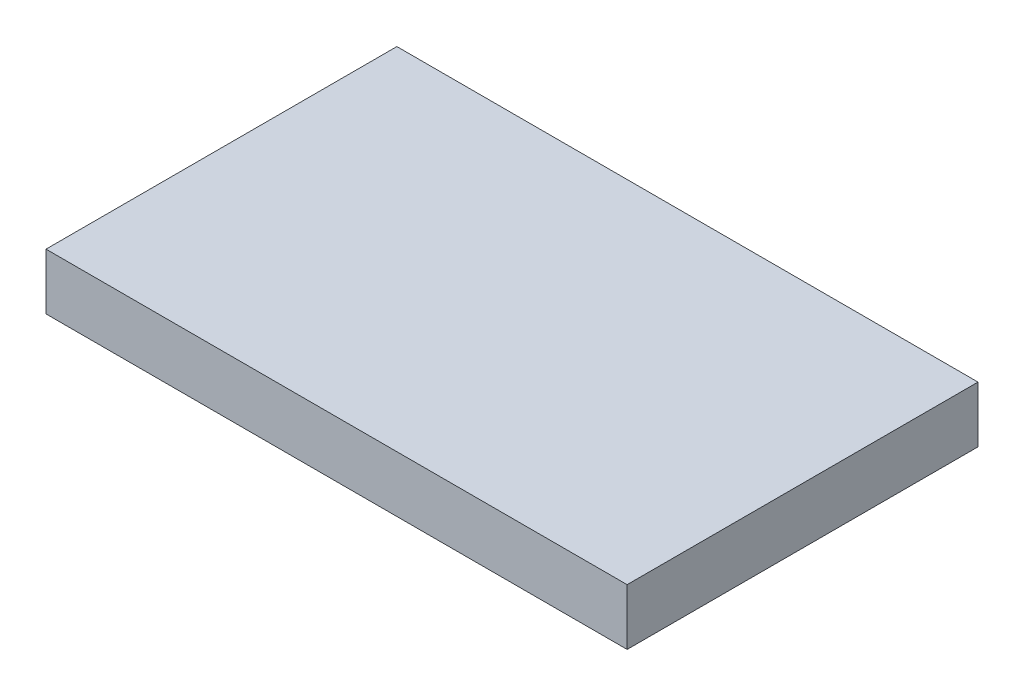
ISO-10303-21;
HEADER;
FILE_DESCRIPTION(('STEP AP214'),'2;1');
FILE_NAME('part.step','',(''),(''),'','','');
FILE_SCHEMA(('AUTOMOTIVE_DESIGN { 1 0 10303 214 1 1 1 1 }'));
ENDSEC;
DATA;
#1=APPLICATION_CONTEXT('core data for automotive mechanical design processes');
#2=APPLICATION_PROTOCOL_DEFINITION('international standard','automotive_design',2000,#1);
#3=PRODUCT_CONTEXT('',#1,'mechanical');
#4=PRODUCT('Part','Part','',(#3));
#5=PRODUCT_RELATED_PRODUCT_CATEGORY('part','',(#4));
#6=PRODUCT_DEFINITION_FORMATION('','',#4);
#7=PRODUCT_DEFINITION_CONTEXT('part definition',#1,'design');
#8=PRODUCT_DEFINITION('design','',#6,#7);
#9=PRODUCT_DEFINITION_SHAPE('','',#8);
#10=(LENGTH_UNIT() NAMED_UNIT(*) SI_UNIT(.MILLI.,.METRE.));
#11=(NAMED_UNIT(*) PLANE_ANGLE_UNIT() SI_UNIT($,.RADIAN.));
#12=(NAMED_UNIT(*) SI_UNIT($,.STERADIAN.) SOLID_ANGLE_UNIT());
#13=UNCERTAINTY_MEASURE_WITH_UNIT(LENGTH_MEASURE(1.E-05),#10,'distance_accuracy_value','');
#14=(GEOMETRIC_REPRESENTATION_CONTEXT(3) GLOBAL_UNCERTAINTY_ASSIGNED_CONTEXT((#13)) GLOBAL_UNIT_ASSIGNED_CONTEXT((#10,
#11,#12)) REPRESENTATION_CONTEXT('',''));
#15=CARTESIAN_POINT('',(0.,0.,0.));
#16=DIRECTION('',(0.,0.,1.));
#17=DIRECTION('',(1.,0.,0.));
#18=AXIS2_PLACEMENT_3D('',#15,#16,#17);
#19=CARTESIAN_POINT('',(-79.1667159895659,2.54,12.0363188886958));
#20=DIRECTION('',(-1.,0.,0.));
#21=DIRECTION('',(0.,0.,1.));
#22=AXIS2_PLACEMENT_3D('',#19,#20,#21);
#23=PLANE('',#22);
#24=DIRECTION('',(0.,0.,-1.));
#25=VECTOR('',#24,1.);
#26=CARTESIAN_POINT('',(-79.1667159895659,0.,12.0363188886958));
#27=LINE('',#26,#25);
#28=CARTESIAN_POINT('',(-79.1667159895659,0.,12.0363188886958));
#29=VERTEX_POINT('',#28);
#30=CARTESIAN_POINT('',(-79.1667159895659,0.,-3.84665861391308));
#31=VERTEX_POINT('',#30);
#32=EDGE_CURVE('E96',#29,#31,#27,.T.);
#33=ORIENTED_EDGE('',*,*,#32,.T.);
#34=DIRECTION('',(0.,-1.,0.));
#35=VECTOR('',#34,1.);
#36=CARTESIAN_POINT('',(-79.1667159895659,2.54,-3.84665861391308));
#37=LINE('',#36,#35);
#38=CARTESIAN_POINT('',(-79.1667159895659,2.54,-3.84665861391308));
#39=VERTEX_POINT('',#38);
#40=EDGE_CURVE('E11',#39,#31,#37,.T.);
#41=ORIENTED_EDGE('',*,*,#40,.F.);
#42=DIRECTION('',(0.,0.,-1.));
#43=VECTOR('',#42,1.);
#44=CARTESIAN_POINT('',(-79.1667159895659,2.54,12.0363188886958));
#45=LINE('',#44,#43);
#46=CARTESIAN_POINT('',(-79.1667159895659,2.54,12.0363188886958));
#47=VERTEX_POINT('',#46);
#48=EDGE_CURVE('E84',#47,#39,#45,.T.);
#49=ORIENTED_EDGE('',*,*,#48,.F.);
#50=DIRECTION('',(0.,-1.,0.));
#51=VECTOR('',#50,1.);
#52=CARTESIAN_POINT('',(-79.1667159895659,2.54,12.0363188886958));
#53=LINE('',#52,#51);
#54=EDGE_CURVE('E92',#47,#29,#53,.T.);
#55=ORIENTED_EDGE('',*,*,#54,.T.);
#56=EDGE_LOOP('',(#33,#41,#49,#55));
#57=FACE_BOUND('',#56,.T.);
#58=ADVANCED_FACE('F33',(#57),#23,.F.);
#59=CARTESIAN_POINT('',(-105.472897478262,2.54,-3.84665861391308));
#60=DIRECTION('',(0.,0.,1.));
#61=DIRECTION('',(1.,0.,0.));
#62=AXIS2_PLACEMENT_3D('',#59,#60,#61);
#63=PLANE('',#62);
#64=DIRECTION('',(-1.,0.,0.));
#65=VECTOR('',#64,1.);
#66=CARTESIAN_POINT('',(-105.472897478262,0.,-3.84665861391308));
#67=LINE('',#66,#65);
#68=CARTESIAN_POINT('',(-105.472897478262,0.,-3.84665861391308));
#69=VERTEX_POINT('',#68);
#70=EDGE_CURVE('E88',#31,#69,#67,.T.);
#71=ORIENTED_EDGE('',*,*,#70,.T.);
#72=DIRECTION('',(0.,-1.,0.));
#73=VECTOR('',#72,1.);
#74=CARTESIAN_POINT('',(-105.472897478262,2.54,-3.84665861391308));
#75=LINE('',#74,#73);
#76=CARTESIAN_POINT('',(-105.472897478262,2.54,-3.84665861391308));
#77=VERTEX_POINT('',#76);
#78=EDGE_CURVE('E41',#77,#69,#75,.T.);
#79=ORIENTED_EDGE('',*,*,#78,.F.);
#80=DIRECTION('',(-1.,0.,0.));
#81=VECTOR('',#80,1.);
#82=CARTESIAN_POINT('',(-105.472897478262,2.54,-3.84665861391308));
#83=LINE('',#82,#81);
#84=EDGE_CURVE('E79',#39,#77,#83,.T.);
#85=ORIENTED_EDGE('',*,*,#84,.F.);
#86=ORIENTED_EDGE('',*,*,#40,.T.);
#87=EDGE_LOOP('',(#71,#79,#85,#86));
#88=FACE_BOUND('',#87,.T.);
#89=ADVANCED_FACE('F87',(#88),#63,.F.);
#90=CARTESIAN_POINT('',(-105.472897478262,2.54,12.0363188886958));
#91=DIRECTION('',(1.,0.,0.));
#92=DIRECTION('',(0.,0.,-1.));
#93=AXIS2_PLACEMENT_3D('',#90,#91,#92);
#94=PLANE('',#93);
#95=DIRECTION('',(0.,0.,1.));
#96=VECTOR('',#95,1.);
#97=CARTESIAN_POINT('',(-105.472897478262,0.,12.0363188886958));
#98=LINE('',#97,#96);
#99=CARTESIAN_POINT('',(-105.472897478262,0.,12.0363188886958));
#100=VERTEX_POINT('',#99);
#101=EDGE_CURVE('E66',#69,#100,#98,.T.);
#102=ORIENTED_EDGE('',*,*,#101,.T.);
#103=DIRECTION('',(0.,-1.,0.));
#104=VECTOR('',#103,1.);
#105=CARTESIAN_POINT('',(-105.472897478262,2.54,12.0363188886958));
#106=LINE('',#105,#104);
#107=CARTESIAN_POINT('',(-105.472897478262,2.54,12.0363188886958));
#108=VERTEX_POINT('',#107);
#109=EDGE_CURVE('E89',#108,#100,#106,.T.);
#110=ORIENTED_EDGE('',*,*,#109,.F.);
#111=DIRECTION('',(0.,0.,1.));
#112=VECTOR('',#111,1.);
#113=CARTESIAN_POINT('',(-105.472897478262,2.54,12.0363188886958));
#114=LINE('',#113,#112);
#115=EDGE_CURVE('E82',#77,#108,#114,.T.);
#116=ORIENTED_EDGE('',*,*,#115,.F.);
#117=ORIENTED_EDGE('',*,*,#78,.T.);
#118=EDGE_LOOP('',(#102,#110,#116,#117));
#119=FACE_BOUND('',#118,.T.);
#120=ADVANCED_FACE('F90',(#119),#94,.F.);
#121=CARTESIAN_POINT('',(-105.472897478262,2.54,12.0363188886958));
#122=DIRECTION('',(0.,0.,-1.));
#123=DIRECTION('',(-1.,0.,0.));
#124=AXIS2_PLACEMENT_3D('',#121,#122,#123);
#125=PLANE('',#124);
#126=DIRECTION('',(1.,0.,0.));
#127=VECTOR('',#126,1.);
#128=CARTESIAN_POINT('',(-105.472897478262,0.,12.0363188886958));
#129=LINE('',#128,#127);
#130=EDGE_CURVE('E72',#100,#29,#129,.T.);
#131=ORIENTED_EDGE('',*,*,#130,.T.);
#132=ORIENTED_EDGE('',*,*,#54,.F.);
#133=DIRECTION('',(1.,0.,0.));
#134=VECTOR('',#133,1.);
#135=CARTESIAN_POINT('',(-105.472897478262,2.54,12.0363188886958));
#136=LINE('',#135,#134);
#137=EDGE_CURVE('E49',#108,#47,#136,.T.);
#138=ORIENTED_EDGE('',*,*,#137,.F.);
#139=ORIENTED_EDGE('',*,*,#109,.T.);
#140=EDGE_LOOP('',(#131,#132,#138,#139));
#141=FACE_BOUND('',#140,.T.);
#142=ADVANCED_FACE('F103',(#141),#125,.F.);
#143=CARTESIAN_POINT('',(0.,2.54,0.));
#144=DIRECTION('',(0.,-1.,0.));
#145=DIRECTION('',(0.,0.,-1.));
#146=AXIS2_PLACEMENT_3D('',#143,#144,#145);
#147=PLANE('',#146);
#148=ORIENTED_EDGE('',*,*,#48,.T.);
#149=ORIENTED_EDGE('',*,*,#84,.T.);
#150=ORIENTED_EDGE('',*,*,#115,.T.);
#151=ORIENTED_EDGE('',*,*,#137,.T.);
#152=EDGE_LOOP('',(#148,#149,#150,#151));
#153=FACE_BOUND('',#152,.T.);
#154=ADVANCED_FACE('F80',(#153),#147,.F.);
#155=CARTESIAN_POINT('',(0.,0.,0.));
#156=DIRECTION('',(0.,-1.,0.));
#157=DIRECTION('',(0.,0.,-1.));
#158=AXIS2_PLACEMENT_3D('',#155,#156,#157);
#159=PLANE('',#158);
#160=ORIENTED_EDGE('',*,*,#32,.F.);
#161=ORIENTED_EDGE('',*,*,#130,.F.);
#162=ORIENTED_EDGE('',*,*,#101,.F.);
#163=ORIENTED_EDGE('',*,*,#70,.F.);
#164=EDGE_LOOP('',(#160,#161,#162,#163));
#165=FACE_BOUND('',#164,.T.);
#166=ADVANCED_FACE('F106',(#165),#159,.T.);
#167=CLOSED_SHELL('',(#58,#89,#120,#142,#154,#166));
#168=MANIFOLD_SOLID_BREP('B2',#167);
#169=ADVANCED_BREP_SHAPE_REPRESENTATION('',(#18,#168),#14);
#170=SHAPE_DEFINITION_REPRESENTATION(#9,#169);
ENDSEC;
END-ISO-10303-21;
